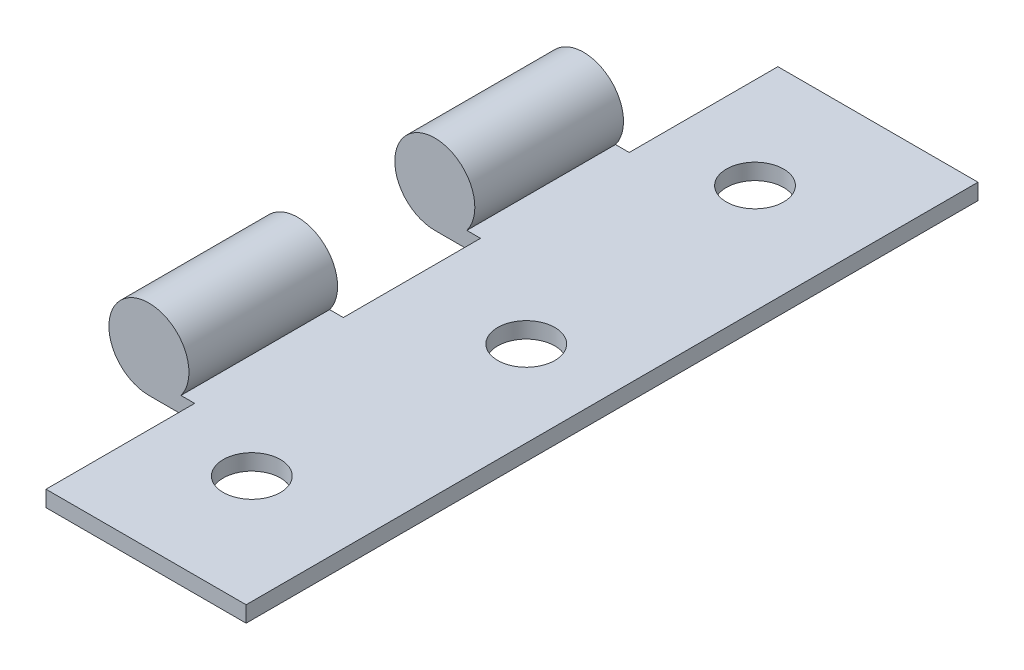
ISO-10303-21;
HEADER;
FILE_DESCRIPTION(('STEP AP214'),'2;1');
FILE_NAME('part.step','',(''),(''),'','','');
FILE_SCHEMA(('AUTOMOTIVE_DESIGN { 1 0 10303 214 1 1 1 1 }'));
ENDSEC;
DATA;
#1=APPLICATION_CONTEXT('core data for automotive mechanical design processes');
#2=APPLICATION_PROTOCOL_DEFINITION('international standard','automotive_design',2000,#1);
#3=PRODUCT_CONTEXT('',#1,'mechanical');
#4=PRODUCT('Part','Part','',(#3));
#5=PRODUCT_RELATED_PRODUCT_CATEGORY('part','',(#4));
#6=PRODUCT_DEFINITION_FORMATION('','',#4);
#7=PRODUCT_DEFINITION_CONTEXT('part definition',#1,'design');
#8=PRODUCT_DEFINITION('design','',#6,#7);
#9=PRODUCT_DEFINITION_SHAPE('','',#8);
#10=(LENGTH_UNIT() NAMED_UNIT(*) SI_UNIT(.MILLI.,.METRE.));
#11=(NAMED_UNIT(*) PLANE_ANGLE_UNIT() SI_UNIT($,.RADIAN.));
#12=(NAMED_UNIT(*) SI_UNIT($,.STERADIAN.) SOLID_ANGLE_UNIT());
#13=UNCERTAINTY_MEASURE_WITH_UNIT(LENGTH_MEASURE(1.E-05),#10,'distance_accuracy_value','');
#14=(GEOMETRIC_REPRESENTATION_CONTEXT(3) GLOBAL_UNCERTAINTY_ASSIGNED_CONTEXT((#13)) GLOBAL_UNIT_ASSIGNED_CONTEXT((#10,
#11,#12)) REPRESENTATION_CONTEXT('',''));
#15=CARTESIAN_POINT('',(0.,0.,0.));
#16=DIRECTION('',(0.,0.,1.));
#17=DIRECTION('',(1.,0.,0.));
#18=AXIS2_PLACEMENT_3D('',#15,#16,#17);
#19=CARTESIAN_POINT('',(0.,0.,64.));
#20=DIRECTION('',(0.,1.,0.));
#21=DIRECTION('',(0.,0.,1.));
#22=AXIS2_PLACEMENT_3D('',#19,#20,#21);
#23=PLANE('',#22);
#24=CARTESIAN_POINT('',(11.999999876,0.,10.000000066));
#25=DIRECTION('',(0.,1.,0.));
#26=DIRECTION('',(0.,0.,1.));
#27=AXIS2_PLACEMENT_3D('',#24,#25,#26);
#28=CIRCLE('',#27,2.49999995299997);
#29=CARTESIAN_POINT('',(11.999999876,0.,7.50000011300003));
#30=VERTEX_POINT('',#29);
#31=EDGE_CURVE('E173',#30,#30,#28,.T.);
#32=ORIENTED_EDGE('',*,*,#31,.T.);
#33=EDGE_LOOP('',(#32));
#34=FACE_BOUND('',#33,.T.);
#35=CARTESIAN_POINT('',(13.999999876,0.,32.000000008));
#36=DIRECTION('',(0.,1.,0.));
#37=DIRECTION('',(0.,0.,1.));
#38=AXIS2_PLACEMENT_3D('',#35,#36,#37);
#39=CIRCLE('',#38,2.49999995299996);
#40=CARTESIAN_POINT('',(13.999999876,0.,29.500000055));
#41=VERTEX_POINT('',#40);
#42=EDGE_CURVE('E177',#41,#41,#39,.T.);
#43=ORIENTED_EDGE('',*,*,#42,.T.);
#44=EDGE_LOOP('',(#43));
#45=FACE_BOUND('',#44,.T.);
#46=CARTESIAN_POINT('',(11.999999876,0.,53.99999995));
#47=DIRECTION('',(0.,1.,0.));
#48=DIRECTION('',(0.,0.,1.));
#49=AXIS2_PLACEMENT_3D('',#46,#47,#48);
#50=CIRCLE('',#49,2.49999995299997);
#51=CARTESIAN_POINT('',(11.999999876,0.,51.499999997));
#52=VERTEX_POINT('',#51);
#53=EDGE_CURVE('E181',#52,#52,#50,.T.);
#54=ORIENTED_EDGE('',*,*,#53,.T.);
#55=EDGE_LOOP('',(#54));
#56=FACE_BOUND('',#55,.T.);
#57=DIRECTION('',(0.,0.,-1.));
#58=VECTOR('',#57,1.);
#59=CARTESIAN_POINT('',(4.,0.,51.));
#60=LINE('',#59,#58);
#61=CARTESIAN_POINT('',(4.00000000000001,0.,64.));
#62=VERTEX_POINT('',#61);
#63=CARTESIAN_POINT('',(4.,0.,51.));
#64=VERTEX_POINT('',#63);
#65=EDGE_CURVE('E50',#62,#64,#60,.T.);
#66=ORIENTED_EDGE('',*,*,#65,.T.);
#67=DIRECTION('',(-1.,0.,0.));
#68=VECTOR('',#67,1.);
#69=CARTESIAN_POINT('',(-4.,0.,51.));
#70=LINE('',#69,#68);
#71=CARTESIAN_POINT('',(0.,0.,51.));
#72=VERTEX_POINT('',#71);
#73=EDGE_CURVE('E129',#64,#72,#70,.T.);
#74=ORIENTED_EDGE('',*,*,#73,.T.);
#75=DIRECTION('',(0.,0.,-1.));
#76=VECTOR('',#75,1.);
#77=CARTESIAN_POINT('',(0.,0.,64.));
#78=LINE('',#77,#76);
#79=CARTESIAN_POINT('',(0.,0.,38.));
#80=VERTEX_POINT('',#79);
#81=EDGE_CURVE('E208',#72,#80,#78,.T.);
#82=ORIENTED_EDGE('',*,*,#81,.T.);
#83=DIRECTION('',(1.,0.,0.));
#84=VECTOR('',#83,1.);
#85=CARTESIAN_POINT('',(-3.99999999999999,0.,38.));
#86=LINE('',#85,#84);
#87=CARTESIAN_POINT('',(4.00000000000001,0.,38.));
#88=VERTEX_POINT('',#87);
#89=EDGE_CURVE('E145',#80,#88,#86,.T.);
#90=ORIENTED_EDGE('',*,*,#89,.T.);
#91=DIRECTION('',(0.,0.,-1.));
#92=VECTOR('',#91,1.);
#93=CARTESIAN_POINT('',(4.,0.,26.));
#94=LINE('',#93,#92);
#95=CARTESIAN_POINT('',(4.,0.,26.));
#96=VERTEX_POINT('',#95);
#97=EDGE_CURVE('E148',#88,#96,#94,.T.);
#98=ORIENTED_EDGE('',*,*,#97,.T.);
#99=DIRECTION('',(-1.,0.,0.));
#100=VECTOR('',#99,1.);
#101=CARTESIAN_POINT('',(-4.,0.,26.));
#102=LINE('',#101,#100);
#103=CARTESIAN_POINT('',(0.,0.,26.));
#104=VERTEX_POINT('',#103);
#105=EDGE_CURVE('E151',#96,#104,#102,.T.);
#106=ORIENTED_EDGE('',*,*,#105,.T.);
#107=CARTESIAN_POINT('',(0.,0.,13.));
#108=VERTEX_POINT('',#107);
#109=EDGE_CURVE('E207',#104,#108,#78,.T.);
#110=ORIENTED_EDGE('',*,*,#109,.T.);
#111=DIRECTION('',(1.,0.,0.));
#112=VECTOR('',#111,1.);
#113=CARTESIAN_POINT('',(-4.,0.,13.));
#114=LINE('',#113,#112);
#115=CARTESIAN_POINT('',(4.00000000000001,0.,13.));
#116=VERTEX_POINT('',#115);
#117=EDGE_CURVE('E161',#108,#116,#114,.T.);
#118=ORIENTED_EDGE('',*,*,#117,.T.);
#119=DIRECTION('',(0.,0.,-1.));
#120=VECTOR('',#119,1.);
#121=CARTESIAN_POINT('',(4.,0.,0.));
#122=LINE('',#121,#120);
#123=CARTESIAN_POINT('',(4.,0.,0.));
#124=VERTEX_POINT('',#123);
#125=EDGE_CURVE('E164',#116,#124,#122,.T.);
#126=ORIENTED_EDGE('',*,*,#125,.T.);
#127=DIRECTION('',(1.,0.,0.));
#128=VECTOR('',#127,1.);
#129=CARTESIAN_POINT('',(0.,0.,0.));
#130=LINE('',#129,#128);
#131=CARTESIAN_POINT('',(21.499999926,0.,0.));
#132=VERTEX_POINT('',#131);
#133=EDGE_CURVE('E193',#124,#132,#130,.T.);
#134=ORIENTED_EDGE('',*,*,#133,.T.);
#135=DIRECTION('',(0.,0.,-1.));
#136=VECTOR('',#135,1.);
#137=CARTESIAN_POINT('',(21.499999926,0.,64.));
#138=LINE('',#137,#136);
#139=CARTESIAN_POINT('',(21.499999926,0.,64.));
#140=VERTEX_POINT('',#139);
#141=EDGE_CURVE('E204',#140,#132,#138,.T.);
#142=ORIENTED_EDGE('',*,*,#141,.F.);
#143=DIRECTION('',(1.,0.,0.));
#144=VECTOR('',#143,1.);
#145=CARTESIAN_POINT('',(0.,0.,64.));
#146=LINE('',#145,#144);
#147=EDGE_CURVE('E139',#62,#140,#146,.T.);
#148=ORIENTED_EDGE('',*,*,#147,.F.);
#149=EDGE_LOOP('',(#66,#74,#82,#90,#98,#106,#110,#118,#126,#134,#142,#148));
#150=FACE_BOUND('',#149,.T.);
#151=ADVANCED_FACE('F35',(#34,#45,#56,#150),#23,.F.);
#152=CARTESIAN_POINT('',(2.7999999925,1.4,64.));
#153=DIRECTION('',(0.,-1.,0.));
#154=DIRECTION('',(1.,0.,0.));
#155=AXIS2_PLACEMENT_3D('',#152,#153,#154);
#156=PLANE('',#155);
#157=CARTESIAN_POINT('',(11.999999876,1.4,10.000000066));
#158=DIRECTION('',(0.,-1.,0.));
#159=DIRECTION('',(1.,0.,0.));
#160=AXIS2_PLACEMENT_3D('',#157,#158,#159);
#161=CIRCLE('',#160,2.49999995299997);
#162=CARTESIAN_POINT('',(11.999999876,1.4,7.50000011300003));
#163=VERTEX_POINT('',#162);
#164=EDGE_CURVE('E176',#163,#163,#161,.F.);
#165=ORIENTED_EDGE('',*,*,#164,.F.);
#166=EDGE_LOOP('',(#165));
#167=FACE_BOUND('',#166,.T.);
#168=CARTESIAN_POINT('',(13.999999876,1.4,32.000000008));
#169=DIRECTION('',(0.,-1.,0.));
#170=DIRECTION('',(1.,0.,0.));
#171=AXIS2_PLACEMENT_3D('',#168,#169,#170);
#172=CIRCLE('',#171,2.49999995299996);
#173=CARTESIAN_POINT('',(13.999999876,1.4,29.500000055));
#174=VERTEX_POINT('',#173);
#175=EDGE_CURVE('E180',#174,#174,#172,.F.);
#176=ORIENTED_EDGE('',*,*,#175,.F.);
#177=EDGE_LOOP('',(#176));
#178=FACE_BOUND('',#177,.T.);
#179=CARTESIAN_POINT('',(11.999999876,1.4,53.99999995));
#180=DIRECTION('',(0.,-1.,0.));
#181=DIRECTION('',(1.,0.,0.));
#182=AXIS2_PLACEMENT_3D('',#179,#180,#181);
#183=CIRCLE('',#182,2.49999995299997);
#184=CARTESIAN_POINT('',(11.999999876,1.4,51.499999997));
#185=VERTEX_POINT('',#184);
#186=EDGE_CURVE('E184',#185,#185,#183,.F.);
#187=ORIENTED_EDGE('',*,*,#186,.F.);
#188=EDGE_LOOP('',(#187));
#189=FACE_BOUND('',#188,.T.);
#190=DIRECTION('',(0.,0.,-1.));
#191=VECTOR('',#190,1.);
#192=CARTESIAN_POINT('',(4.00000000000001,1.4,64.));
#193=LINE('',#192,#191);
#194=CARTESIAN_POINT('',(4.00000000000001,1.4,64.));
#195=VERTEX_POINT('',#194);
#196=CARTESIAN_POINT('',(4.,1.4,51.));
#197=VERTEX_POINT('',#196);
#198=EDGE_CURVE('E126',#195,#197,#193,.T.);
#199=ORIENTED_EDGE('',*,*,#198,.F.);
#200=DIRECTION('',(-1.,0.,0.));
#201=VECTOR('',#200,1.);
#202=CARTESIAN_POINT('',(2.7999999925,1.4,64.));
#203=LINE('',#202,#201);
#204=CARTESIAN_POINT('',(21.499999926,1.4,64.));
#205=VERTEX_POINT('',#204);
#206=EDGE_CURVE('E189',#205,#195,#203,.T.);
#207=ORIENTED_EDGE('',*,*,#206,.F.);
#208=DIRECTION('',(0.,0.,-1.));
#209=VECTOR('',#208,1.);
#210=CARTESIAN_POINT('',(21.499999926,1.4,64.));
#211=LINE('',#210,#209);
#212=CARTESIAN_POINT('',(21.499999926,1.4,0.));
#213=VERTEX_POINT('',#212);
#214=EDGE_CURVE('E201',#205,#213,#211,.T.);
#215=ORIENTED_EDGE('',*,*,#214,.T.);
#216=DIRECTION('',(-1.,0.,0.));
#217=VECTOR('',#216,1.);
#218=CARTESIAN_POINT('',(2.7999999925,1.4,0.));
#219=LINE('',#218,#217);
#220=CARTESIAN_POINT('',(4.,1.4,0.));
#221=VERTEX_POINT('',#220);
#222=EDGE_CURVE('E187',#213,#221,#219,.T.);
#223=ORIENTED_EDGE('',*,*,#222,.T.);
#224=DIRECTION('',(0.,0.,-1.));
#225=VECTOR('',#224,1.);
#226=CARTESIAN_POINT('',(4.00000000000001,1.4,64.));
#227=LINE('',#226,#225);
#228=CARTESIAN_POINT('',(4.00000000000001,1.4,13.));
#229=VERTEX_POINT('',#228);
#230=EDGE_CURVE('E169',#229,#221,#227,.T.);
#231=ORIENTED_EDGE('',*,*,#230,.F.);
#232=DIRECTION('',(1.,0.,0.));
#233=VECTOR('',#232,1.);
#234=CARTESIAN_POINT('',(2.7999999925,1.4,13.));
#235=LINE('',#234,#233);
#236=CARTESIAN_POINT('',(2.7999999925,1.4,13.));
#237=VERTEX_POINT('',#236);
#238=EDGE_CURVE('E171',#237,#229,#235,.T.);
#239=ORIENTED_EDGE('',*,*,#238,.F.);
#240=DIRECTION('',(0.,0.,-1.));
#241=VECTOR('',#240,1.);
#242=CARTESIAN_POINT('',(2.7999999925,1.4,64.));
#243=LINE('',#242,#241);
#244=CARTESIAN_POINT('',(2.7999999925,1.4,26.));
#245=VERTEX_POINT('',#244);
#246=EDGE_CURVE('E192',#245,#237,#243,.T.);
#247=ORIENTED_EDGE('',*,*,#246,.F.);
#248=DIRECTION('',(-1.,0.,0.));
#249=VECTOR('',#248,1.);
#250=CARTESIAN_POINT('',(2.7999999925,1.4,26.));
#251=LINE('',#250,#249);
#252=CARTESIAN_POINT('',(4.,1.4,26.));
#253=VERTEX_POINT('',#252);
#254=EDGE_CURVE('E58',#253,#245,#251,.T.);
#255=ORIENTED_EDGE('',*,*,#254,.F.);
#256=DIRECTION('',(0.,0.,-1.));
#257=VECTOR('',#256,1.);
#258=CARTESIAN_POINT('',(4.00000000000001,1.4,64.));
#259=LINE('',#258,#257);
#260=CARTESIAN_POINT('',(4.00000000000001,1.4,38.));
#261=VERTEX_POINT('',#260);
#262=EDGE_CURVE('E226',#261,#253,#259,.T.);
#263=ORIENTED_EDGE('',*,*,#262,.F.);
#264=DIRECTION('',(1.,0.,0.));
#265=VECTOR('',#264,1.);
#266=CARTESIAN_POINT('',(2.7999999925,1.4,38.));
#267=LINE('',#266,#265);
#268=CARTESIAN_POINT('',(2.7999999925,1.4,38.));
#269=VERTEX_POINT('',#268);
#270=EDGE_CURVE('E159',#269,#261,#267,.T.);
#271=ORIENTED_EDGE('',*,*,#270,.F.);
#272=CARTESIAN_POINT('',(2.7999999925,1.4,51.));
#273=VERTEX_POINT('',#272);
#274=EDGE_CURVE('E199',#273,#269,#243,.T.);
#275=ORIENTED_EDGE('',*,*,#274,.F.);
#276=DIRECTION('',(-1.,0.,0.));
#277=VECTOR('',#276,1.);
#278=CARTESIAN_POINT('',(2.7999999925,1.4,51.));
#279=LINE('',#278,#277);
#280=EDGE_CURVE('E143',#197,#273,#279,.T.);
#281=ORIENTED_EDGE('',*,*,#280,.F.);
#282=EDGE_LOOP('',(#199,#207,#215,#223,#231,#239,#247,#255,#263,#271,#275,#281));
#283=FACE_BOUND('',#282,.T.);
#284=ADVANCED_FACE('F231',(#167,#178,#189,#283),#156,.F.);
#285=CARTESIAN_POINT('',(0.,3.499999985,64.));
#286=DIRECTION('',(0.,0.,-1.));
#287=DIRECTION('',(-1.,0.,0.));
#288=AXIS2_PLACEMENT_3D('',#285,#286,#287);
#289=CYLINDRICAL_SURFACE('',#288,3.499999985);
#290=CARTESIAN_POINT('',(0.,3.499999985,51.));
#291=DIRECTION('',(0.,0.,1.));
#292=DIRECTION('',(1.,0.,0.));
#293=AXIS2_PLACEMENT_3D('',#290,#291,#292);
#294=CIRCLE('',#293,3.499999985);
#295=EDGE_CURVE('E11',#273,#72,#294,.T.);
#296=ORIENTED_EDGE('',*,*,#295,.F.);
#297=ORIENTED_EDGE('',*,*,#274,.T.);
#298=CARTESIAN_POINT('',(0.,3.499999985,38.));
#299=DIRECTION('',(0.,0.,-1.));
#300=DIRECTION('',(-1.,0.,0.));
#301=AXIS2_PLACEMENT_3D('',#298,#299,#300);
#302=CIRCLE('',#301,3.499999985);
#303=EDGE_CURVE('E223',#80,#269,#302,.T.);
#304=ORIENTED_EDGE('',*,*,#303,.F.);
#305=ORIENTED_EDGE('',*,*,#81,.F.);
#306=EDGE_LOOP('',(#296,#297,#304,#305));
#307=FACE_BOUND('',#306,.T.);
#308=ADVANCED_FACE('F37',(#307),#289,.T.);
#309=CARTESIAN_POINT('',(0.,3.499999985,64.));
#310=DIRECTION('',(0.,0.,1.));
#311=DIRECTION('',(1.,0.,0.));
#312=AXIS2_PLACEMENT_3D('',#309,#310,#311);
#313=PLANE('',#312);
#314=ORIENTED_EDGE('',*,*,#206,.T.);
#315=DIRECTION('',(0.,-1.,0.));
#316=VECTOR('',#315,1.);
#317=CARTESIAN_POINT('',(4.00000000000001,3.499999985,64.));
#318=LINE('',#317,#316);
#319=EDGE_CURVE('E43',#195,#62,#318,.T.);
#320=ORIENTED_EDGE('',*,*,#319,.T.);
#321=ORIENTED_EDGE('',*,*,#147,.T.);
#322=DIRECTION('',(0.,1.,0.));
#323=VECTOR('',#322,1.);
#324=CARTESIAN_POINT('',(21.499999926,0.,64.));
#325=LINE('',#324,#323);
#326=EDGE_CURVE('E186',#140,#205,#325,.T.);
#327=ORIENTED_EDGE('',*,*,#326,.T.);
#328=EDGE_LOOP('',(#314,#320,#321,#327));
#329=FACE_BOUND('',#328,.T.);
#330=ADVANCED_FACE('F228',(#329),#313,.T.);
#331=CARTESIAN_POINT('',(0.,3.499999985,26.));
#332=DIRECTION('',(0.,0.,1.));
#333=DIRECTION('',(1.,0.,0.));
#334=AXIS2_PLACEMENT_3D('',#331,#332,#333);
#335=CIRCLE('',#334,3.499999985);
#336=EDGE_CURVE('E221',#245,#104,#335,.T.);
#337=ORIENTED_EDGE('',*,*,#336,.F.);
#338=ORIENTED_EDGE('',*,*,#246,.T.);
#339=CARTESIAN_POINT('',(0.,3.499999985,13.));
#340=DIRECTION('',(0.,0.,-1.));
#341=DIRECTION('',(-1.,0.,0.));
#342=AXIS2_PLACEMENT_3D('',#339,#340,#341);
#343=CIRCLE('',#342,3.499999985);
#344=EDGE_CURVE('E218',#108,#237,#343,.T.);
#345=ORIENTED_EDGE('',*,*,#344,.F.);
#346=ORIENTED_EDGE('',*,*,#109,.F.);
#347=EDGE_LOOP('',(#337,#338,#345,#346));
#348=FACE_BOUND('',#347,.T.);
#349=ADVANCED_FACE('F249',(#348),#289,.T.);
#350=CARTESIAN_POINT('',(0.,3.499999985,0.));
#351=DIRECTION('',(0.,0.,1.));
#352=DIRECTION('',(1.,0.,0.));
#353=AXIS2_PLACEMENT_3D('',#350,#351,#352);
#354=PLANE('',#353);
#355=DIRECTION('',(0.,-1.,0.));
#356=VECTOR('',#355,1.);
#357=CARTESIAN_POINT('',(4.,3.499999985,0.));
#358=LINE('',#357,#356);
#359=EDGE_CURVE('E210',#221,#124,#358,.T.);
#360=ORIENTED_EDGE('',*,*,#359,.F.);
#361=ORIENTED_EDGE('',*,*,#222,.F.);
#362=DIRECTION('',(0.,1.,0.));
#363=VECTOR('',#362,1.);
#364=CARTESIAN_POINT('',(21.499999926,0.,0.));
#365=LINE('',#364,#363);
#366=EDGE_CURVE('E195',#132,#213,#365,.T.);
#367=ORIENTED_EDGE('',*,*,#366,.F.);
#368=ORIENTED_EDGE('',*,*,#133,.F.);
#369=EDGE_LOOP('',(#360,#361,#367,#368));
#370=FACE_BOUND('',#369,.T.);
#371=ADVANCED_FACE('F263',(#370),#354,.F.);
#372=CARTESIAN_POINT('',(21.499999926,0.,64.));
#373=DIRECTION('',(-1.,0.,0.));
#374=DIRECTION('',(0.,0.,1.));
#375=AXIS2_PLACEMENT_3D('',#372,#373,#374);
#376=PLANE('',#375);
#377=ORIENTED_EDGE('',*,*,#366,.T.);
#378=ORIENTED_EDGE('',*,*,#214,.F.);
#379=ORIENTED_EDGE('',*,*,#326,.F.);
#380=ORIENTED_EDGE('',*,*,#141,.T.);
#381=EDGE_LOOP('',(#377,#378,#379,#380));
#382=FACE_BOUND('',#381,.T.);
#383=ADVANCED_FACE('F267',(#382),#376,.F.);
#384=CARTESIAN_POINT('',(11.999999876,4.99999999999999,53.99999995));
#385=DIRECTION('',(0.,-1.,0.));
#386=DIRECTION('',(0.,0.,-1.));
#387=AXIS2_PLACEMENT_3D('',#384,#385,#386);
#388=CYLINDRICAL_SURFACE('',#387,2.49999995299997);
#389=CARTESIAN_POINT('',(11.999999876,0.,51.499999997));
#390=CARTESIAN_POINT('',(11.999999876,0.0145833333333326,51.499999997));
#391=CARTESIAN_POINT('',(11.999999876,0.0291666666666661,51.499999997));
#392=CARTESIAN_POINT('',(11.999999876,0.0583333333333327,51.499999997));
#393=CARTESIAN_POINT('',(11.999999876,0.0729166666666659,51.499999997));
#394=CARTESIAN_POINT('',(11.999999876,0.102083333333332,51.499999997));
#395=CARTESIAN_POINT('',(11.999999876,0.116666666666666,51.499999997));
#396=CARTESIAN_POINT('',(11.999999876,0.145833333333333,51.499999997));
#397=CARTESIAN_POINT('',(11.999999876,0.160416666666666,51.499999997));
#398=CARTESIAN_POINT('',(11.999999876,0.189583333333332,51.499999997));
#399=CARTESIAN_POINT('',(11.999999876,0.204166666666666,51.499999997));
#400=CARTESIAN_POINT('',(11.999999876,0.233333333333333,51.499999997));
#401=CARTESIAN_POINT('',(11.999999876,0.247916666666666,51.499999997));
#402=CARTESIAN_POINT('',(11.999999876,0.277083333333333,51.499999997));
#403=CARTESIAN_POINT('',(11.999999876,0.291666666666666,51.499999997));
#404=CARTESIAN_POINT('',(11.999999876,0.320833333333333,51.499999997));
#405=CARTESIAN_POINT('',(11.999999876,0.335416666666666,51.499999997));
#406=CARTESIAN_POINT('',(11.999999876,0.364583333333333,51.499999997));
#407=CARTESIAN_POINT('',(11.999999876,0.379166666666667,51.499999997));
#408=CARTESIAN_POINT('',(11.999999876,0.408333333333333,51.499999997));
#409=CARTESIAN_POINT('',(11.999999876,0.422916666666666,51.499999997));
#410=CARTESIAN_POINT('',(11.999999876,0.452083333333333,51.499999997));
#411=CARTESIAN_POINT('',(11.999999876,0.466666666666666,51.499999997));
#412=CARTESIAN_POINT('',(11.999999876,0.495833333333333,51.499999997));
#413=CARTESIAN_POINT('',(11.999999876,0.510416666666667,51.499999997));
#414=CARTESIAN_POINT('',(11.999999876,0.539583333333333,51.499999997));
#415=CARTESIAN_POINT('',(11.999999876,0.554166666666667,51.499999997));
#416=CARTESIAN_POINT('',(11.999999876,0.583333333333333,51.499999997));
#417=CARTESIAN_POINT('',(11.999999876,0.597916666666667,51.499999997));
#418=CARTESIAN_POINT('',(11.999999876,0.627083333333333,51.499999997));
#419=CARTESIAN_POINT('',(11.999999876,0.641666666666667,51.499999997));
#420=CARTESIAN_POINT('',(11.999999876,0.670833333333333,51.499999997));
#421=CARTESIAN_POINT('',(11.999999876,0.685416666666667,51.499999997));
#422=CARTESIAN_POINT('',(11.999999876,0.714583333333334,51.499999997));
#423=CARTESIAN_POINT('',(11.999999876,0.729166666666667,51.499999997));
#424=CARTESIAN_POINT('',(11.999999876,0.758333333333334,51.499999997));
#425=CARTESIAN_POINT('',(11.999999876,0.772916666666667,51.499999997));
#426=CARTESIAN_POINT('',(11.999999876,0.802083333333333,51.499999997));
#427=CARTESIAN_POINT('',(11.999999876,0.816666666666667,51.499999997));
#428=CARTESIAN_POINT('',(11.999999876,0.845833333333334,51.499999997));
#429=CARTESIAN_POINT('',(11.999999876,0.860416666666667,51.499999997));
#430=CARTESIAN_POINT('',(11.999999876,0.889583333333333,51.499999997));
#431=CARTESIAN_POINT('',(11.999999876,0.904166666666667,51.499999997));
#432=CARTESIAN_POINT('',(11.999999876,0.933333333333334,51.499999997));
#433=CARTESIAN_POINT('',(11.999999876,0.947916666666667,51.499999997));
#434=CARTESIAN_POINT('',(11.999999876,0.977083333333334,51.499999997));
#435=CARTESIAN_POINT('',(11.999999876,0.991666666666668,51.499999997));
#436=CARTESIAN_POINT('',(11.999999876,1.02083333333333,51.499999997));
#437=CARTESIAN_POINT('',(11.999999876,1.03541666666667,51.499999997));
#438=CARTESIAN_POINT('',(11.999999876,1.06458333333333,51.499999997));
#439=CARTESIAN_POINT('',(11.999999876,1.07916666666667,51.499999997));
#440=CARTESIAN_POINT('',(11.999999876,1.10833333333333,51.499999997));
#441=CARTESIAN_POINT('',(11.999999876,1.12291666666667,51.499999997));
#442=CARTESIAN_POINT('',(11.999999876,1.15208333333333,51.499999997));
#443=CARTESIAN_POINT('',(11.999999876,1.16666666666667,51.499999997));
#444=CARTESIAN_POINT('',(11.999999876,1.19583333333333,51.499999997));
#445=CARTESIAN_POINT('',(11.999999876,1.21041666666667,51.499999997));
#446=CARTESIAN_POINT('',(11.999999876,1.23958333333333,51.499999997));
#447=CARTESIAN_POINT('',(11.999999876,1.25416666666667,51.499999997));
#448=CARTESIAN_POINT('',(11.999999876,1.28333333333333,51.499999997));
#449=CARTESIAN_POINT('',(11.999999876,1.29791666666667,51.499999997));
#450=CARTESIAN_POINT('',(11.999999876,1.32708333333333,51.499999997));
#451=CARTESIAN_POINT('',(11.999999876,1.34166666666667,51.499999997));
#452=CARTESIAN_POINT('',(11.999999876,1.37083333333333,51.499999997));
#453=CARTESIAN_POINT('',(11.999999876,1.38541666666667,51.499999997));
#454=CARTESIAN_POINT('',(11.999999876,1.4,51.499999997));
#455=B_SPLINE_CURVE_WITH_KNOTS('',3,(#389,#390,#391,#392,#393,#394,#395,#396,#397,#398,#399,
#400,#401,#402,#403,#404,#405,#406,#407,#408,#409,#410,#411,#412,#413,#414,#415,#416,#417,#418,
#419,#420,#421,#422,#423,#424,#425,#426,#427,#428,#429,#430,#431,#432,#433,#434,#435,#436,#437,
#438,#439,#440,#441,#442,#443,#444,#445,#446,#447,#448,#449,#450,#451,#452,#453,#454),
.UNSPECIFIED.,.F.,.F.,(4,2,2,2,2,2,2,2,2,2,2,2,2,2,2,2,2,2,2,2,2,2,2,2,2,2,2,2,2,2,2,2,4),(0.,
0.0437500000000004,0.0874999999999999,0.13125,0.175,0.21875,0.262500000000001,0.30625,0.35,
0.393750000000001,0.4375,0.481250000000001,0.525000000000001,0.568750000000001,
0.612500000000001,0.656250000000001,0.700000000000001,0.743750000000001,0.787500000000001,
0.831250000000001,0.875000000000001,0.918750000000001,0.962500000000002,1.00625,1.05,1.09375,
1.1375,1.18125,1.225,1.26875,1.3125,1.35625,1.4),.UNSPECIFIED.);
#456=EDGE_CURVE('BSEAM270',#52,#185,#455,.T.);
#457=ORIENTED_EDGE('',*,*,#53,.F.);
#458=ORIENTED_EDGE('',*,*,#186,.T.);
#459=ORIENTED_EDGE('',*,*,#456,.T.);
#460=ORIENTED_EDGE('',*,*,#456,.F.);
#461=EDGE_LOOP('',(#457,#459,#458,#460));
#462=FACE_BOUND('',#461,.T.);
#463=ADVANCED_FACE('F270',(#462),#388,.F.);
#464=CARTESIAN_POINT('',(13.999999876,4.99999999999999,32.000000008));
#465=DIRECTION('',(0.,-1.,0.));
#466=DIRECTION('',(0.,0.,-1.));
#467=AXIS2_PLACEMENT_3D('',#464,#465,#466);
#468=CYLINDRICAL_SURFACE('',#467,2.49999995299996);
#469=CARTESIAN_POINT('',(13.999999876,0.,29.500000055));
#470=CARTESIAN_POINT('',(13.999999876,0.0145833333333326,29.500000055));
#471=CARTESIAN_POINT('',(13.999999876,0.0291666666666661,29.500000055));
#472=CARTESIAN_POINT('',(13.999999876,0.0583333333333327,29.500000055));
#473=CARTESIAN_POINT('',(13.999999876,0.0729166666666659,29.500000055));
#474=CARTESIAN_POINT('',(13.999999876,0.102083333333332,29.500000055));
#475=CARTESIAN_POINT('',(13.999999876,0.116666666666666,29.500000055));
#476=CARTESIAN_POINT('',(13.999999876,0.145833333333333,29.500000055));
#477=CARTESIAN_POINT('',(13.999999876,0.160416666666666,29.500000055));
#478=CARTESIAN_POINT('',(13.999999876,0.189583333333332,29.500000055));
#479=CARTESIAN_POINT('',(13.999999876,0.204166666666666,29.500000055));
#480=CARTESIAN_POINT('',(13.999999876,0.233333333333333,29.500000055));
#481=CARTESIAN_POINT('',(13.999999876,0.247916666666666,29.500000055));
#482=CARTESIAN_POINT('',(13.999999876,0.277083333333333,29.500000055));
#483=CARTESIAN_POINT('',(13.999999876,0.291666666666666,29.500000055));
#484=CARTESIAN_POINT('',(13.999999876,0.320833333333333,29.500000055));
#485=CARTESIAN_POINT('',(13.999999876,0.335416666666666,29.500000055));
#486=CARTESIAN_POINT('',(13.999999876,0.364583333333333,29.500000055));
#487=CARTESIAN_POINT('',(13.999999876,0.379166666666667,29.500000055));
#488=CARTESIAN_POINT('',(13.999999876,0.408333333333333,29.500000055));
#489=CARTESIAN_POINT('',(13.999999876,0.422916666666666,29.500000055));
#490=CARTESIAN_POINT('',(13.999999876,0.452083333333333,29.500000055));
#491=CARTESIAN_POINT('',(13.999999876,0.466666666666666,29.500000055));
#492=CARTESIAN_POINT('',(13.999999876,0.495833333333333,29.500000055));
#493=CARTESIAN_POINT('',(13.999999876,0.510416666666667,29.500000055));
#494=CARTESIAN_POINT('',(13.999999876,0.539583333333333,29.500000055));
#495=CARTESIAN_POINT('',(13.999999876,0.554166666666667,29.500000055));
#496=CARTESIAN_POINT('',(13.999999876,0.583333333333333,29.500000055));
#497=CARTESIAN_POINT('',(13.999999876,0.597916666666667,29.500000055));
#498=CARTESIAN_POINT('',(13.999999876,0.627083333333333,29.500000055));
#499=CARTESIAN_POINT('',(13.999999876,0.641666666666667,29.500000055));
#500=CARTESIAN_POINT('',(13.999999876,0.670833333333333,29.500000055));
#501=CARTESIAN_POINT('',(13.999999876,0.685416666666667,29.500000055));
#502=CARTESIAN_POINT('',(13.999999876,0.714583333333334,29.500000055));
#503=CARTESIAN_POINT('',(13.999999876,0.729166666666667,29.500000055));
#504=CARTESIAN_POINT('',(13.999999876,0.758333333333334,29.500000055));
#505=CARTESIAN_POINT('',(13.999999876,0.772916666666667,29.500000055));
#506=CARTESIAN_POINT('',(13.999999876,0.802083333333333,29.500000055));
#507=CARTESIAN_POINT('',(13.999999876,0.816666666666667,29.500000055));
#508=CARTESIAN_POINT('',(13.999999876,0.845833333333334,29.500000055));
#509=CARTESIAN_POINT('',(13.999999876,0.860416666666667,29.500000055));
#510=CARTESIAN_POINT('',(13.999999876,0.889583333333333,29.500000055));
#511=CARTESIAN_POINT('',(13.999999876,0.904166666666667,29.500000055));
#512=CARTESIAN_POINT('',(13.999999876,0.933333333333334,29.500000055));
#513=CARTESIAN_POINT('',(13.999999876,0.947916666666667,29.500000055));
#514=CARTESIAN_POINT('',(13.999999876,0.977083333333334,29.500000055));
#515=CARTESIAN_POINT('',(13.999999876,0.991666666666668,29.500000055));
#516=CARTESIAN_POINT('',(13.999999876,1.02083333333333,29.500000055));
#517=CARTESIAN_POINT('',(13.999999876,1.03541666666667,29.500000055));
#518=CARTESIAN_POINT('',(13.999999876,1.06458333333333,29.500000055));
#519=CARTESIAN_POINT('',(13.999999876,1.07916666666667,29.500000055));
#520=CARTESIAN_POINT('',(13.999999876,1.10833333333333,29.500000055));
#521=CARTESIAN_POINT('',(13.999999876,1.12291666666667,29.500000055));
#522=CARTESIAN_POINT('',(13.999999876,1.15208333333333,29.500000055));
#523=CARTESIAN_POINT('',(13.999999876,1.16666666666667,29.500000055));
#524=CARTESIAN_POINT('',(13.999999876,1.19583333333333,29.500000055));
#525=CARTESIAN_POINT('',(13.999999876,1.21041666666667,29.500000055));
#526=CARTESIAN_POINT('',(13.999999876,1.23958333333333,29.500000055));
#527=CARTESIAN_POINT('',(13.999999876,1.25416666666667,29.500000055));
#528=CARTESIAN_POINT('',(13.999999876,1.28333333333333,29.500000055));
#529=CARTESIAN_POINT('',(13.999999876,1.29791666666667,29.500000055));
#530=CARTESIAN_POINT('',(13.999999876,1.32708333333333,29.500000055));
#531=CARTESIAN_POINT('',(13.999999876,1.34166666666667,29.500000055));
#532=CARTESIAN_POINT('',(13.999999876,1.37083333333333,29.500000055));
#533=CARTESIAN_POINT('',(13.999999876,1.38541666666667,29.500000055));
#534=CARTESIAN_POINT('',(13.999999876,1.4,29.500000055));
#535=B_SPLINE_CURVE_WITH_KNOTS('',3,(#469,#470,#471,#472,#473,#474,#475,#476,#477,#478,#479,
#480,#481,#482,#483,#484,#485,#486,#487,#488,#489,#490,#491,#492,#493,#494,#495,#496,#497,#498,
#499,#500,#501,#502,#503,#504,#505,#506,#507,#508,#509,#510,#511,#512,#513,#514,#515,#516,#517,
#518,#519,#520,#521,#522,#523,#524,#525,#526,#527,#528,#529,#530,#531,#532,#533,#534),
.UNSPECIFIED.,.F.,.F.,(4,2,2,2,2,2,2,2,2,2,2,2,2,2,2,2,2,2,2,2,2,2,2,2,2,2,2,2,2,2,2,2,4),(0.,
0.0437500000000004,0.0874999999999999,0.13125,0.175,0.21875,0.262500000000001,0.30625,0.35,
0.393750000000001,0.4375,0.481250000000001,0.525000000000001,0.568750000000001,
0.612500000000001,0.656250000000001,0.700000000000001,0.743750000000001,0.787500000000001,
0.831250000000001,0.875000000000001,0.918750000000001,0.962500000000002,1.00625,1.05,1.09375,
1.1375,1.18125,1.225,1.26875,1.3125,1.35625,1.4),.UNSPECIFIED.);
#536=EDGE_CURVE('BSEAM276',#41,#174,#535,.T.);
#537=ORIENTED_EDGE('',*,*,#42,.F.);
#538=ORIENTED_EDGE('',*,*,#175,.T.);
#539=ORIENTED_EDGE('',*,*,#536,.T.);
#540=ORIENTED_EDGE('',*,*,#536,.F.);
#541=EDGE_LOOP('',(#537,#539,#538,#540));
#542=FACE_BOUND('',#541,.T.);
#543=ADVANCED_FACE('F276',(#542),#468,.F.);
#544=CARTESIAN_POINT('',(11.999999876,4.99999999999999,10.000000066));
#545=DIRECTION('',(0.,-1.,0.));
#546=DIRECTION('',(0.,0.,-1.));
#547=AXIS2_PLACEMENT_3D('',#544,#545,#546);
#548=CYLINDRICAL_SURFACE('',#547,2.49999995299997);
#549=CARTESIAN_POINT('',(11.999999876,0.,7.50000011300003));
#550=CARTESIAN_POINT('',(11.999999876,0.0145833333333326,7.50000011300003));
#551=CARTESIAN_POINT('',(11.999999876,0.0291666666666661,7.50000011300003));
#552=CARTESIAN_POINT('',(11.999999876,0.0583333333333327,7.50000011300003));
#553=CARTESIAN_POINT('',(11.999999876,0.0729166666666659,7.50000011300003));
#554=CARTESIAN_POINT('',(11.999999876,0.102083333333332,7.50000011300003));
#555=CARTESIAN_POINT('',(11.999999876,0.116666666666666,7.50000011300003));
#556=CARTESIAN_POINT('',(11.999999876,0.145833333333333,7.50000011300003));
#557=CARTESIAN_POINT('',(11.999999876,0.160416666666666,7.50000011300003));
#558=CARTESIAN_POINT('',(11.999999876,0.189583333333332,7.50000011300003));
#559=CARTESIAN_POINT('',(11.999999876,0.204166666666666,7.50000011300003));
#560=CARTESIAN_POINT('',(11.999999876,0.233333333333333,7.50000011300003));
#561=CARTESIAN_POINT('',(11.999999876,0.247916666666666,7.50000011300003));
#562=CARTESIAN_POINT('',(11.999999876,0.277083333333333,7.50000011300003));
#563=CARTESIAN_POINT('',(11.999999876,0.291666666666666,7.50000011300003));
#564=CARTESIAN_POINT('',(11.999999876,0.320833333333333,7.50000011300003));
#565=CARTESIAN_POINT('',(11.999999876,0.335416666666666,7.50000011300003));
#566=CARTESIAN_POINT('',(11.999999876,0.364583333333333,7.50000011300003));
#567=CARTESIAN_POINT('',(11.999999876,0.379166666666667,7.50000011300003));
#568=CARTESIAN_POINT('',(11.999999876,0.408333333333333,7.50000011300003));
#569=CARTESIAN_POINT('',(11.999999876,0.422916666666666,7.50000011300003));
#570=CARTESIAN_POINT('',(11.999999876,0.452083333333333,7.50000011300003));
#571=CARTESIAN_POINT('',(11.999999876,0.466666666666666,7.50000011300003));
#572=CARTESIAN_POINT('',(11.999999876,0.495833333333333,7.50000011300003));
#573=CARTESIAN_POINT('',(11.999999876,0.510416666666667,7.50000011300003));
#574=CARTESIAN_POINT('',(11.999999876,0.539583333333333,7.50000011300003));
#575=CARTESIAN_POINT('',(11.999999876,0.554166666666667,7.50000011300003));
#576=CARTESIAN_POINT('',(11.999999876,0.583333333333333,7.50000011300003));
#577=CARTESIAN_POINT('',(11.999999876,0.597916666666667,7.50000011300003));
#578=CARTESIAN_POINT('',(11.999999876,0.627083333333333,7.50000011300003));
#579=CARTESIAN_POINT('',(11.999999876,0.641666666666667,7.50000011300003));
#580=CARTESIAN_POINT('',(11.999999876,0.670833333333333,7.50000011300003));
#581=CARTESIAN_POINT('',(11.999999876,0.685416666666667,7.50000011300003));
#582=CARTESIAN_POINT('',(11.999999876,0.714583333333334,7.50000011300003));
#583=CARTESIAN_POINT('',(11.999999876,0.729166666666667,7.50000011300003));
#584=CARTESIAN_POINT('',(11.999999876,0.758333333333334,7.50000011300003));
#585=CARTESIAN_POINT('',(11.999999876,0.772916666666667,7.50000011300003));
#586=CARTESIAN_POINT('',(11.999999876,0.802083333333333,7.50000011300003));
#587=CARTESIAN_POINT('',(11.999999876,0.816666666666667,7.50000011300003));
#588=CARTESIAN_POINT('',(11.999999876,0.845833333333334,7.50000011300003));
#589=CARTESIAN_POINT('',(11.999999876,0.860416666666667,7.50000011300003));
#590=CARTESIAN_POINT('',(11.999999876,0.889583333333333,7.50000011300003));
#591=CARTESIAN_POINT('',(11.999999876,0.904166666666667,7.50000011300003));
#592=CARTESIAN_POINT('',(11.999999876,0.933333333333334,7.50000011300003));
#593=CARTESIAN_POINT('',(11.999999876,0.947916666666667,7.50000011300003));
#594=CARTESIAN_POINT('',(11.999999876,0.977083333333334,7.50000011300003));
#595=CARTESIAN_POINT('',(11.999999876,0.991666666666668,7.50000011300003));
#596=CARTESIAN_POINT('',(11.999999876,1.02083333333333,7.50000011300003));
#597=CARTESIAN_POINT('',(11.999999876,1.03541666666667,7.50000011300003));
#598=CARTESIAN_POINT('',(11.999999876,1.06458333333333,7.50000011300003));
#599=CARTESIAN_POINT('',(11.999999876,1.07916666666667,7.50000011300003));
#600=CARTESIAN_POINT('',(11.999999876,1.10833333333333,7.50000011300003));
#601=CARTESIAN_POINT('',(11.999999876,1.12291666666667,7.50000011300003));
#602=CARTESIAN_POINT('',(11.999999876,1.15208333333333,7.50000011300003));
#603=CARTESIAN_POINT('',(11.999999876,1.16666666666667,7.50000011300003));
#604=CARTESIAN_POINT('',(11.999999876,1.19583333333333,7.50000011300003));
#605=CARTESIAN_POINT('',(11.999999876,1.21041666666667,7.50000011300003));
#606=CARTESIAN_POINT('',(11.999999876,1.23958333333333,7.50000011300003));
#607=CARTESIAN_POINT('',(11.999999876,1.25416666666667,7.50000011300003));
#608=CARTESIAN_POINT('',(11.999999876,1.28333333333333,7.50000011300003));
#609=CARTESIAN_POINT('',(11.999999876,1.29791666666667,7.50000011300003));
#610=CARTESIAN_POINT('',(11.999999876,1.32708333333333,7.50000011300003));
#611=CARTESIAN_POINT('',(11.999999876,1.34166666666667,7.50000011300003));
#612=CARTESIAN_POINT('',(11.999999876,1.37083333333333,7.50000011300003));
#613=CARTESIAN_POINT('',(11.999999876,1.38541666666667,7.50000011300003));
#614=CARTESIAN_POINT('',(11.999999876,1.4,7.50000011300003));
#615=B_SPLINE_CURVE_WITH_KNOTS('',3,(#549,#550,#551,#552,#553,#554,#555,#556,#557,#558,#559,
#560,#561,#562,#563,#564,#565,#566,#567,#568,#569,#570,#571,#572,#573,#574,#575,#576,#577,#578,
#579,#580,#581,#582,#583,#584,#585,#586,#587,#588,#589,#590,#591,#592,#593,#594,#595,#596,#597,
#598,#599,#600,#601,#602,#603,#604,#605,#606,#607,#608,#609,#610,#611,#612,#613,#614),
.UNSPECIFIED.,.F.,.F.,(4,2,2,2,2,2,2,2,2,2,2,2,2,2,2,2,2,2,2,2,2,2,2,2,2,2,2,2,2,2,2,2,4),(0.,
0.0437500000000004,0.0874999999999999,0.13125,0.175,0.21875,0.262500000000001,0.30625,0.35,
0.393750000000001,0.4375,0.481250000000001,0.525000000000001,0.568750000000001,
0.612500000000001,0.656250000000001,0.700000000000001,0.743750000000001,0.787500000000001,
0.831250000000001,0.875000000000001,0.918750000000001,0.962500000000002,1.00625,1.05,1.09375,
1.1375,1.18125,1.225,1.26875,1.3125,1.35625,1.4),.UNSPECIFIED.);
#616=EDGE_CURVE('BSEAM298',#30,#163,#615,.T.);
#617=ORIENTED_EDGE('',*,*,#31,.F.);
#618=ORIENTED_EDGE('',*,*,#164,.T.);
#619=ORIENTED_EDGE('',*,*,#616,.T.);
#620=ORIENTED_EDGE('',*,*,#616,.F.);
#621=EDGE_LOOP('',(#617,#619,#618,#620));
#622=FACE_BOUND('',#621,.T.);
#623=ADVANCED_FACE('F298',(#622),#548,.F.);
#624=CARTESIAN_POINT('',(-4.,15.,13.));
#625=DIRECTION('',(0.,0.,-1.));
#626=DIRECTION('',(-1.,0.,0.));
#627=AXIS2_PLACEMENT_3D('',#624,#625,#626);
#628=PLANE('',#627);
#629=ORIENTED_EDGE('',*,*,#238,.T.);
#630=DIRECTION('',(0.,-1.,0.));
#631=VECTOR('',#630,1.);
#632=CARTESIAN_POINT('',(4.00000000000001,15.,13.));
#633=LINE('',#632,#631);
#634=EDGE_CURVE('E167',#229,#116,#633,.T.);
#635=ORIENTED_EDGE('',*,*,#634,.T.);
#636=ORIENTED_EDGE('',*,*,#117,.F.);
#637=ORIENTED_EDGE('',*,*,#344,.T.);
#638=EDGE_LOOP('',(#629,#635,#636,#637));
#639=FACE_BOUND('',#638,.T.);
#640=ADVANCED_FACE('F253',(#639),#628,.T.);
#641=CARTESIAN_POINT('',(4.,15.,0.));
#642=DIRECTION('',(-1.,0.,0.));
#643=DIRECTION('',(0.,0.,1.));
#644=AXIS2_PLACEMENT_3D('',#641,#642,#643);
#645=PLANE('',#644);
#646=ORIENTED_EDGE('',*,*,#230,.T.);
#647=ORIENTED_EDGE('',*,*,#359,.T.);
#648=ORIENTED_EDGE('',*,*,#125,.F.);
#649=ORIENTED_EDGE('',*,*,#634,.F.);
#650=EDGE_LOOP('',(#646,#647,#648,#649));
#651=FACE_BOUND('',#650,.T.);
#652=ADVANCED_FACE('F259',(#651),#645,.T.);
#653=CARTESIAN_POINT('',(4.,15.,26.));
#654=DIRECTION('',(-1.,0.,0.));
#655=DIRECTION('',(0.,0.,1.));
#656=AXIS2_PLACEMENT_3D('',#653,#654,#655);
#657=PLANE('',#656);
#658=ORIENTED_EDGE('',*,*,#262,.T.);
#659=DIRECTION('',(0.,-1.,0.));
#660=VECTOR('',#659,1.);
#661=CARTESIAN_POINT('',(4.,15.,26.));
#662=LINE('',#661,#660);
#663=EDGE_CURVE('E154',#253,#96,#662,.T.);
#664=ORIENTED_EDGE('',*,*,#663,.T.);
#665=ORIENTED_EDGE('',*,*,#97,.F.);
#666=DIRECTION('',(0.,-1.,0.));
#667=VECTOR('',#666,1.);
#668=CARTESIAN_POINT('',(4.00000000000001,15.,38.));
#669=LINE('',#668,#667);
#670=EDGE_CURVE('E156',#261,#88,#669,.T.);
#671=ORIENTED_EDGE('',*,*,#670,.F.);
#672=EDGE_LOOP('',(#658,#664,#665,#671));
#673=FACE_BOUND('',#672,.T.);
#674=ADVANCED_FACE('F243',(#673),#657,.T.);
#675=CARTESIAN_POINT('',(-3.99999999999999,15.,38.));
#676=DIRECTION('',(0.,0.,-1.));
#677=DIRECTION('',(-1.,0.,0.));
#678=AXIS2_PLACEMENT_3D('',#675,#676,#677);
#679=PLANE('',#678);
#680=ORIENTED_EDGE('',*,*,#270,.T.);
#681=ORIENTED_EDGE('',*,*,#670,.T.);
#682=ORIENTED_EDGE('',*,*,#89,.F.);
#683=ORIENTED_EDGE('',*,*,#303,.T.);
#684=EDGE_LOOP('',(#680,#681,#682,#683));
#685=FACE_BOUND('',#684,.T.);
#686=ADVANCED_FACE('F238',(#685),#679,.T.);
#687=CARTESIAN_POINT('',(-4.,15.,26.));
#688=DIRECTION('',(0.,0.,1.));
#689=DIRECTION('',(1.,0.,0.));
#690=AXIS2_PLACEMENT_3D('',#687,#688,#689);
#691=PLANE('',#690);
#692=ORIENTED_EDGE('',*,*,#254,.T.);
#693=ORIENTED_EDGE('',*,*,#336,.T.);
#694=ORIENTED_EDGE('',*,*,#105,.F.);
#695=ORIENTED_EDGE('',*,*,#663,.F.);
#696=EDGE_LOOP('',(#692,#693,#694,#695));
#697=FACE_BOUND('',#696,.T.);
#698=ADVANCED_FACE('F373',(#697),#691,.T.);
#699=CARTESIAN_POINT('',(-4.,15.,51.));
#700=DIRECTION('',(0.,0.,1.));
#701=DIRECTION('',(1.,0.,0.));
#702=AXIS2_PLACEMENT_3D('',#699,#700,#701);
#703=PLANE('',#702);
#704=ORIENTED_EDGE('',*,*,#280,.T.);
#705=ORIENTED_EDGE('',*,*,#295,.T.);
#706=ORIENTED_EDGE('',*,*,#73,.F.);
#707=DIRECTION('',(0.,-1.,0.));
#708=VECTOR('',#707,1.);
#709=CARTESIAN_POINT('',(4.,15.,51.));
#710=LINE('',#709,#708);
#711=EDGE_CURVE('E122',#197,#64,#710,.T.);
#712=ORIENTED_EDGE('',*,*,#711,.F.);
#713=EDGE_LOOP('',(#704,#705,#706,#712));
#714=FACE_BOUND('',#713,.T.);
#715=ADVANCED_FACE('F132',(#714),#703,.T.);
#716=CARTESIAN_POINT('',(4.,15.,51.));
#717=DIRECTION('',(-1.,0.,0.));
#718=DIRECTION('',(0.,0.,1.));
#719=AXIS2_PLACEMENT_3D('',#716,#717,#718);
#720=PLANE('',#719);
#721=ORIENTED_EDGE('',*,*,#198,.T.);
#722=ORIENTED_EDGE('',*,*,#711,.T.);
#723=ORIENTED_EDGE('',*,*,#65,.F.);
#724=ORIENTED_EDGE('',*,*,#319,.F.);
#725=EDGE_LOOP('',(#721,#722,#723,#724));
#726=FACE_BOUND('',#725,.T.);
#727=ADVANCED_FACE('F124',(#726),#720,.T.);
#728=CLOSED_SHELL('',(#151,#284,#308,#330,#349,#371,#383,#463,#543,#623,#640,#652,#674,#686,
#698,#715,#727));
#729=MANIFOLD_SOLID_BREP('B2',#728);
#730=ADVANCED_BREP_SHAPE_REPRESENTATION('',(#18,#729),#14);
#731=SHAPE_DEFINITION_REPRESENTATION(#9,#730);
ENDSEC;
END-ISO-10303-21;
